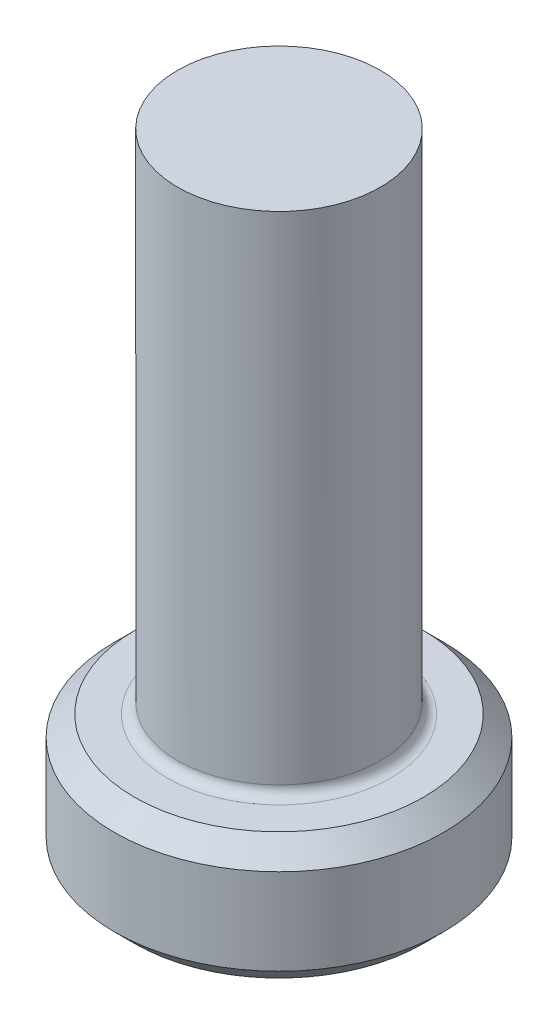
ISO-10303-21;
HEADER;
FILE_DESCRIPTION(('STEP AP214'),'2;1');
FILE_NAME('part.step','',(''),(''),'','','');
FILE_SCHEMA(('AUTOMOTIVE_DESIGN { 1 0 10303 214 1 1 1 1 }'));
ENDSEC;
DATA;
#1=APPLICATION_CONTEXT('core data for automotive mechanical design processes');
#2=APPLICATION_PROTOCOL_DEFINITION('international standard','automotive_design',2000,#1);
#3=PRODUCT_CONTEXT('',#1,'mechanical');
#4=PRODUCT('Part','Part','',(#3));
#5=PRODUCT_RELATED_PRODUCT_CATEGORY('part','',(#4));
#6=PRODUCT_DEFINITION_FORMATION('','',#4);
#7=PRODUCT_DEFINITION_CONTEXT('part definition',#1,'design');
#8=PRODUCT_DEFINITION('design','',#6,#7);
#9=PRODUCT_DEFINITION_SHAPE('','',#8);
#10=(LENGTH_UNIT() NAMED_UNIT(*) SI_UNIT(.MILLI.,.METRE.));
#11=(NAMED_UNIT(*) PLANE_ANGLE_UNIT() SI_UNIT($,.RADIAN.));
#12=(NAMED_UNIT(*) SI_UNIT($,.STERADIAN.) SOLID_ANGLE_UNIT());
#13=UNCERTAINTY_MEASURE_WITH_UNIT(LENGTH_MEASURE(1.E-05),#10,'distance_accuracy_value','');
#14=(GEOMETRIC_REPRESENTATION_CONTEXT(3) GLOBAL_UNCERTAINTY_ASSIGNED_CONTEXT((#13)) GLOBAL_UNIT_ASSIGNED_CONTEXT((#10,
#11,#12)) REPRESENTATION_CONTEXT('',''));
#15=CARTESIAN_POINT('',(0.,0.,0.));
#16=DIRECTION('',(0.,0.,1.));
#17=DIRECTION('',(1.,0.,0.));
#18=AXIS2_PLACEMENT_3D('',#15,#16,#17);
#19=CARTESIAN_POINT('',(-196.679346014084,-605.774998597379,-866.486183378033));
#20=DIRECTION('',(0.,1.,0.));
#21=DIRECTION('',(-1.,0.,0.));
#22=AXIS2_PLACEMENT_3D('',#19,#20,#21);
#23=PLANE('',#22);
#24=DIRECTION('',(-0.5,0.,0.866025403784439));
#25=VECTOR('',#24,1.);
#26=CARTESIAN_POINT('',(-199.566097360032,-605.774998597379,-866.486183378033));
#27=LINE('',#26,#25);
#28=CARTESIAN_POINT('',(-199.566097360032,-605.774998597379,-866.486183378033));
#29=VERTEX_POINT('',#28);
#30=CARTESIAN_POINT('',(-198.122721687058,-605.774998597379,-868.986183378033));
#31=VERTEX_POINT('',#30);
#32=EDGE_CURVE('E322',#29,#31,#27,.F.);
#33=ORIENTED_EDGE('',*,*,#32,.T.);
#34=DIRECTION('',(-1.,0.,0.));
#35=VECTOR('',#34,1.);
#36=CARTESIAN_POINT('',(-198.122721687058,-605.774998597379,-868.986183378033));
#37=LINE('',#36,#35);
#38=CARTESIAN_POINT('',(-195.23597034111,-605.774998597379,-868.986183378033));
#39=VERTEX_POINT('',#38);
#40=EDGE_CURVE('E327',#31,#39,#37,.F.);
#41=ORIENTED_EDGE('',*,*,#40,.T.);
#42=DIRECTION('',(-0.5,0.,-0.866025403784439));
#43=VECTOR('',#42,1.);
#44=CARTESIAN_POINT('',(-195.23597034111,-605.774998597379,-868.986183378033));
#45=LINE('',#44,#43);
#46=CARTESIAN_POINT('',(-193.792594668136,-605.774998597379,-866.486183378033));
#47=VERTEX_POINT('',#46);
#48=EDGE_CURVE('E305',#39,#47,#45,.F.);
#49=ORIENTED_EDGE('',*,*,#48,.T.);
#50=DIRECTION('',(0.5,0.,-0.866025403784439));
#51=VECTOR('',#50,1.);
#52=CARTESIAN_POINT('',(-193.792594668136,-605.774998597379,-866.486183378033));
#53=LINE('',#52,#51);
#54=CARTESIAN_POINT('',(-195.23597034111,-605.774998597379,-863.986183378033));
#55=VERTEX_POINT('',#54);
#56=EDGE_CURVE('E91',#47,#55,#53,.F.);
#57=ORIENTED_EDGE('',*,*,#56,.T.);
#58=DIRECTION('',(1.,0.,0.));
#59=VECTOR('',#58,1.);
#60=CARTESIAN_POINT('',(-195.23597034111,-605.774998597379,-863.986183378033));
#61=LINE('',#60,#59);
#62=CARTESIAN_POINT('',(-198.122721687058,-605.774998597379,-863.986183378033));
#63=VERTEX_POINT('',#62);
#64=EDGE_CURVE('E75',#55,#63,#61,.F.);
#65=ORIENTED_EDGE('',*,*,#64,.T.);
#66=DIRECTION('',(0.5,0.,0.866025403784439));
#67=VECTOR('',#66,1.);
#68=CARTESIAN_POINT('',(-198.122721687058,-605.774998597379,-863.986183378033));
#69=LINE('',#68,#67);
#70=EDGE_CURVE('E80',#63,#29,#69,.F.);
#71=ORIENTED_EDGE('',*,*,#70,.T.);
#72=EDGE_LOOP('',(#33,#41,#49,#57,#65,#71));
#73=FACE_BOUND('',#72,.T.);
#74=ADVANCED_FACE('F17',(#73),#23,.F.);
#75=CARTESIAN_POINT('',(-198.122721687058,-609.574998597379,-863.986183378033));
#76=DIRECTION('',(-0.866025403784439,0.,0.5));
#77=DIRECTION('',(0.5,0.,0.866025403784439));
#78=AXIS2_PLACEMENT_3D('',#75,#76,#77);
#79=PLANE('',#78);
#80=DIRECTION('',(0.,1.,0.));
#81=VECTOR('',#80,1.);
#82=CARTESIAN_POINT('',(-198.122721687058,-609.574998597379,-863.986183378033));
#83=LINE('',#82,#81);
#84=CARTESIAN_POINT('',(-198.122721687058,-609.574998597379,-863.986183378033));
#85=VERTEX_POINT('',#84);
#86=EDGE_CURVE('E82',#63,#85,#83,.F.);
#87=ORIENTED_EDGE('',*,*,#86,.T.);
#88=DIRECTION('',(0.499999999999843,0.,0.866025403784529));
#89=VECTOR('',#88,1.);
#90=CARTESIAN_POINT('',(-199.566097360032,-609.574998597379,-866.486183378034));
#91=LINE('',#90,#89);
#92=CARTESIAN_POINT('',(-199.566097360032,-609.574998597379,-866.486183378034));
#93=VERTEX_POINT('',#92);
#94=EDGE_CURVE('E317',#93,#85,#91,.T.);
#95=ORIENTED_EDGE('',*,*,#94,.F.);
#96=DIRECTION('',(0.,1.,0.));
#97=VECTOR('',#96,1.);
#98=CARTESIAN_POINT('',(-199.566097360032,-609.574998597379,-866.486183378034));
#99=LINE('',#98,#97);
#100=EDGE_CURVE('E85',#93,#29,#99,.T.);
#101=ORIENTED_EDGE('',*,*,#100,.T.);
#102=ORIENTED_EDGE('',*,*,#70,.F.);
#103=EDGE_LOOP('',(#87,#95,#101,#102));
#104=FACE_BOUND('',#103,.T.);
#105=ADVANCED_FACE('F81',(#104),#79,.F.);
#106=CARTESIAN_POINT('',(-195.23597034111,-609.574998597379,-863.986183378033));
#107=DIRECTION('',(0.,0.,1.));
#108=DIRECTION('',(1.,0.,0.));
#109=AXIS2_PLACEMENT_3D('',#106,#107,#108);
#110=PLANE('',#109);
#111=DIRECTION('',(0.,1.,0.));
#112=VECTOR('',#111,1.);
#113=CARTESIAN_POINT('',(-195.23597034111,-609.574998597379,-863.986183378033));
#114=LINE('',#113,#112);
#115=CARTESIAN_POINT('',(-195.23597034111,-609.574998597379,-863.986183378033));
#116=VERTEX_POINT('',#115);
#117=EDGE_CURVE('E93',#55,#116,#114,.F.);
#118=ORIENTED_EDGE('',*,*,#117,.T.);
#119=DIRECTION('',(1.,0.,0.));
#120=VECTOR('',#119,1.);
#121=CARTESIAN_POINT('',(-196.679346014084,-609.574998597379,-863.986183378033));
#122=LINE('',#121,#120);
#123=EDGE_CURVE('E97',#85,#116,#122,.T.);
#124=ORIENTED_EDGE('',*,*,#123,.F.);
#125=ORIENTED_EDGE('',*,*,#86,.F.);
#126=ORIENTED_EDGE('',*,*,#64,.F.);
#127=EDGE_LOOP('',(#118,#124,#125,#126));
#128=FACE_BOUND('',#127,.T.);
#129=ADVANCED_FACE('F95',(#128),#110,.F.);
#130=CARTESIAN_POINT('',(-193.792594668136,-609.574998597379,-866.486183378033));
#131=DIRECTION('',(0.866025403784439,0.,0.5));
#132=DIRECTION('',(0.5,0.,-0.866025403784439));
#133=AXIS2_PLACEMENT_3D('',#130,#131,#132);
#134=PLANE('',#133);
#135=DIRECTION('',(0.,1.,0.));
#136=VECTOR('',#135,1.);
#137=CARTESIAN_POINT('',(-193.792594668136,-609.574998597379,-866.486183378033));
#138=LINE('',#137,#136);
#139=CARTESIAN_POINT('',(-193.792594668136,-609.574998597379,-866.486183378034));
#140=VERTEX_POINT('',#139);
#141=EDGE_CURVE('E301',#47,#140,#138,.F.);
#142=ORIENTED_EDGE('',*,*,#141,.T.);
#143=DIRECTION('',(0.499999999999843,0.,-0.866025403784529));
#144=VECTOR('',#143,1.);
#145=CARTESIAN_POINT('',(-195.23597034111,-609.574998597379,-863.986183378033));
#146=LINE('',#145,#144);
#147=EDGE_CURVE('E304',#116,#140,#146,.T.);
#148=ORIENTED_EDGE('',*,*,#147,.F.);
#149=ORIENTED_EDGE('',*,*,#117,.F.);
#150=ORIENTED_EDGE('',*,*,#56,.F.);
#151=EDGE_LOOP('',(#142,#148,#149,#150));
#152=FACE_BOUND('',#151,.T.);
#153=ADVANCED_FACE('F258',(#152),#134,.F.);
#154=CARTESIAN_POINT('',(-195.23597034111,-609.574998597379,-868.986183378033));
#155=DIRECTION('',(0.866025403784439,0.,-0.5));
#156=DIRECTION('',(-0.5,0.,-0.866025403784439));
#157=AXIS2_PLACEMENT_3D('',#154,#155,#156);
#158=PLANE('',#157);
#159=DIRECTION('',(0.,1.,0.));
#160=VECTOR('',#159,1.);
#161=CARTESIAN_POINT('',(-195.23597034111,-609.574998597379,-868.986183378033));
#162=LINE('',#161,#160);
#163=CARTESIAN_POINT('',(-195.23597034111,-609.574998597379,-868.986183378033));
#164=VERTEX_POINT('',#163);
#165=EDGE_CURVE('E310',#39,#164,#162,.F.);
#166=ORIENTED_EDGE('',*,*,#165,.T.);
#167=DIRECTION('',(-0.500000000000126,0.,-0.866025403784366));
#168=VECTOR('',#167,1.);
#169=CARTESIAN_POINT('',(-193.792594668136,-609.574998597379,-866.486183378034));
#170=LINE('',#169,#168);
#171=EDGE_CURVE('E308',#140,#164,#170,.T.);
#172=ORIENTED_EDGE('',*,*,#171,.F.);
#173=ORIENTED_EDGE('',*,*,#141,.F.);
#174=ORIENTED_EDGE('',*,*,#48,.F.);
#175=EDGE_LOOP('',(#166,#172,#173,#174));
#176=FACE_BOUND('',#175,.T.);
#177=ADVANCED_FACE('F249',(#176),#158,.F.);
#178=CARTESIAN_POINT('',(-198.122721687058,-609.574998597379,-868.986183378033));
#179=DIRECTION('',(0.,0.,-1.));
#180=DIRECTION('',(-1.,0.,0.));
#181=AXIS2_PLACEMENT_3D('',#178,#179,#180);
#182=PLANE('',#181);
#183=DIRECTION('',(0.,1.,0.));
#184=VECTOR('',#183,1.);
#185=CARTESIAN_POINT('',(-198.122721687058,-609.574998597379,-868.986183378033));
#186=LINE('',#185,#184);
#187=CARTESIAN_POINT('',(-198.122721687058,-609.574998597379,-868.986183378033));
#188=VERTEX_POINT('',#187);
#189=EDGE_CURVE('E325',#31,#188,#186,.F.);
#190=ORIENTED_EDGE('',*,*,#189,.T.);
#191=DIRECTION('',(1.,0.,0.));
#192=VECTOR('',#191,1.);
#193=CARTESIAN_POINT('',(-196.679346014084,-609.574998597379,-868.986183378033));
#194=LINE('',#193,#192);
#195=EDGE_CURVE('E313',#164,#188,#194,.F.);
#196=ORIENTED_EDGE('',*,*,#195,.F.);
#197=ORIENTED_EDGE('',*,*,#165,.F.);
#198=ORIENTED_EDGE('',*,*,#40,.F.);
#199=EDGE_LOOP('',(#190,#196,#197,#198));
#200=FACE_BOUND('',#199,.T.);
#201=ADVANCED_FACE('F240',(#200),#182,.F.);
#202=CARTESIAN_POINT('',(-199.566097360032,-609.574998597379,-866.486183378033));
#203=DIRECTION('',(-0.866025403784439,0.,-0.5));
#204=DIRECTION('',(-0.5,0.,0.866025403784439));
#205=AXIS2_PLACEMENT_3D('',#202,#203,#204);
#206=PLANE('',#205);
#207=ORIENTED_EDGE('',*,*,#100,.F.);
#208=DIRECTION('',(-0.500000000000126,0.,0.866025403784366));
#209=VECTOR('',#208,1.);
#210=CARTESIAN_POINT('',(-198.122721687058,-609.574998597379,-868.986183378033));
#211=LINE('',#210,#209);
#212=EDGE_CURVE('E112',#188,#93,#211,.T.);
#213=ORIENTED_EDGE('',*,*,#212,.F.);
#214=ORIENTED_EDGE('',*,*,#189,.F.);
#215=ORIENTED_EDGE('',*,*,#32,.F.);
#216=EDGE_LOOP('',(#207,#213,#214,#215));
#217=FACE_BOUND('',#216,.T.);
#218=ADVANCED_FACE('F231',(#217),#206,.F.);
#219=CARTESIAN_POINT('',(-196.679346014084,-609.574998597379,-869.336183378034));
#220=DIRECTION('',(0.,-1.,0.));
#221=DIRECTION('',(1.,0.,0.));
#222=AXIS2_PLACEMENT_3D('',#219,#220,#221);
#223=PLANE('',#222);
#224=ORIENTED_EDGE('',*,*,#195,.T.);
#225=ORIENTED_EDGE('',*,*,#212,.T.);
#226=ORIENTED_EDGE('',*,*,#94,.T.);
#227=ORIENTED_EDGE('',*,*,#123,.T.);
#228=ORIENTED_EDGE('',*,*,#147,.T.);
#229=ORIENTED_EDGE('',*,*,#171,.T.);
#230=EDGE_LOOP('',(#224,#225,#226,#227,#228,#229));
#231=FACE_BOUND('',#230,.T.);
#232=CARTESIAN_POINT('',(-196.679346014084,-609.574998597379,-866.486183378033));
#233=DIRECTION('',(0.,1.,0.));
#234=DIRECTION('',(0.,0.,1.));
#235=AXIS2_PLACEMENT_3D('',#232,#233,#234);
#236=CIRCLE('',#235,5.69999999999893);
#237=CARTESIAN_POINT('',(-196.679346014084,-609.574998597379,-860.786183378034));
#238=VERTEX_POINT('',#237);
#239=EDGE_CURVE('E109',#238,#238,#236,.T.);
#240=ORIENTED_EDGE('',*,*,#239,.F.);
#241=EDGE_LOOP('',(#240));
#242=FACE_BOUND('',#241,.T.);
#243=ADVANCED_FACE('F222',(#231,#242),#223,.T.);
#244=CARTESIAN_POINT('',(-196.679346014084,-608.774998597378,-866.486183378033));
#245=DIRECTION('',(0.,1.,0.));
#246=DIRECTION('',(0.,0.,1.));
#247=AXIS2_PLACEMENT_3D('',#244,#245,#246);
#248=CONICAL_SURFACE('',#247,6.49999999999951,0.785398163397448);
#249=ORIENTED_EDGE('',*,*,#239,.T.);
#250=EDGE_LOOP('',(#249));
#251=FACE_BOUND('',#250,.T.);
#252=CARTESIAN_POINT('',(-196.679346014084,-608.774998597379,-866.486183378033));
#253=DIRECTION('',(0.,1.,0.));
#254=DIRECTION('',(-1.,0.,0.));
#255=AXIS2_PLACEMENT_3D('',#252,#253,#254);
#256=CIRCLE('',#255,6.49999999999998);
#257=CARTESIAN_POINT('',(-203.179346014084,-608.774998597379,-866.486183378033));
#258=VERTEX_POINT('',#257);
#259=EDGE_CURVE('E111',#258,#258,#256,.T.);
#260=ORIENTED_EDGE('',*,*,#259,.F.);
#261=EDGE_LOOP('',(#260));
#262=FACE_BOUND('',#261,.T.);
#263=ADVANCED_FACE('F214',(#251,#262),#248,.T.);
#264=CARTESIAN_POINT('',(-196.679346014084,-607.074998597379,-866.486183378033));
#265=DIRECTION('',(0.,1.,0.));
#266=DIRECTION('',(-1.,0.,0.));
#267=AXIS2_PLACEMENT_3D('',#264,#265,#266);
#268=CYLINDRICAL_SURFACE('',#267,6.49999999999998);
#269=CARTESIAN_POINT('',(-196.679346014084,-605.374998597379,-866.486183378033));
#270=DIRECTION('',(0.,-1.,0.));
#271=DIRECTION('',(0.,0.,-1.));
#272=AXIS2_PLACEMENT_3D('',#269,#270,#271);
#273=CIRCLE('',#272,6.49999999999895);
#274=CARTESIAN_POINT('',(-196.679346014084,-605.374998597379,-872.986183378032));
#275=VERTEX_POINT('',#274);
#276=EDGE_CURVE('E108',#275,#275,#273,.F.);
#277=ORIENTED_EDGE('',*,*,#276,.F.);
#278=EDGE_LOOP('',(#277));
#279=FACE_BOUND('',#278,.T.);
#280=ORIENTED_EDGE('',*,*,#259,.T.);
#281=EDGE_LOOP('',(#280));
#282=FACE_BOUND('',#281,.T.);
#283=ADVANCED_FACE('F206',(#279,#282),#268,.T.);
#284=CARTESIAN_POINT('',(-196.679346014084,-605.374998597379,-866.486183378033));
#285=DIRECTION('',(0.,-1.,0.));
#286=DIRECTION('',(1.,0.,0.));
#287=AXIS2_PLACEMENT_3D('',#284,#285,#286);
#288=CONICAL_SURFACE('',#287,6.49999999999895,0.785398163397448);
#289=CARTESIAN_POINT('',(-196.679346014084,-604.574998597379,-866.486183378033));
#290=DIRECTION('',(0.,-1.,0.));
#291=DIRECTION('',(1.,0.,0.));
#292=AXIS2_PLACEMENT_3D('',#289,#290,#291);
#293=CIRCLE('',#292,5.69999999999948);
#294=CARTESIAN_POINT('',(-190.979346014085,-604.574998597379,-866.486183378033));
#295=VERTEX_POINT('',#294);
#296=EDGE_CURVE('E105',#295,#295,#293,.F.);
#297=ORIENTED_EDGE('',*,*,#296,.F.);
#298=EDGE_LOOP('',(#297));
#299=FACE_BOUND('',#298,.T.);
#300=ORIENTED_EDGE('',*,*,#276,.T.);
#301=EDGE_LOOP('',(#300));
#302=FACE_BOUND('',#301,.T.);
#303=ADVANCED_FACE('F136',(#299,#302),#288,.T.);
#304=CARTESIAN_POINT('',(-196.679346014084,-604.574998597379,-871.536183378033));
#305=DIRECTION('',(0.,1.,0.));
#306=DIRECTION('',(-1.,0.,0.));
#307=AXIS2_PLACEMENT_3D('',#304,#305,#306);
#308=PLANE('',#307);
#309=CARTESIAN_POINT('',(-196.679346014084,-604.57499859738,-866.486183378033));
#310=DIRECTION('',(0.,1.,0.));
#311=DIRECTION('',(0.,0.,1.));
#312=AXIS2_PLACEMENT_3D('',#309,#310,#311);
#313=CIRCLE('',#312,4.40000000000007);
#314=CARTESIAN_POINT('',(-196.679346014084,-604.57499859738,-870.886183378033));
#315=VERTEX_POINT('',#314);
#316=CARTESIAN_POINT('',(-196.679346014084,-604.57499859738,-862.086183378033));
#317=VERTEX_POINT('',#316);
#318=EDGE_CURVE('E104',#315,#317,#313,.F.);
#319=ORIENTED_EDGE('',*,*,#318,.T.);
#320=CARTESIAN_POINT('',(-196.679346014084,-604.57499859738,-866.486183378033));
#321=DIRECTION('',(0.,1.,0.));
#322=DIRECTION('',(0.,0.,-1.));
#323=AXIS2_PLACEMENT_3D('',#320,#321,#322);
#324=CIRCLE('',#323,4.40000000000007);
#325=EDGE_CURVE('E36',#317,#315,#324,.F.);
#326=ORIENTED_EDGE('',*,*,#325,.T.);
#327=EDGE_LOOP('',(#319,#326));
#328=FACE_BOUND('',#327,.T.);
#329=ORIENTED_EDGE('',*,*,#296,.T.);
#330=EDGE_LOOP('',(#329));
#331=FACE_BOUND('',#330,.T.);
#332=ADVANCED_FACE('F117',(#328,#331),#308,.T.);
#333=CARTESIAN_POINT('',(-196.679346014084,-584.57499859738,-868.486183378033));
#334=DIRECTION('',(0.,1.,0.));
#335=DIRECTION('',(-1.,0.,0.));
#336=AXIS2_PLACEMENT_3D('',#333,#334,#335);
#337=PLANE('',#336);
#338=CARTESIAN_POINT('',(-196.679346014084,-584.57499859738,-866.486183378033));
#339=DIRECTION('',(0.,1.,0.));
#340=DIRECTION('',(-1.,0.,0.));
#341=AXIS2_PLACEMENT_3D('',#338,#339,#340);
#342=CIRCLE('',#341,4.);
#343=CARTESIAN_POINT('',(-200.679346014084,-584.57499859738,-866.486183378033));
#344=VERTEX_POINT('',#343);
#345=EDGE_CURVE('E28',#344,#344,#342,.F.);
#346=ORIENTED_EDGE('',*,*,#345,.F.);
#347=EDGE_LOOP('',(#346));
#348=FACE_BOUND('',#347,.T.);
#349=ADVANCED_FACE('F135',(#348),#337,.T.);
#350=CARTESIAN_POINT('',(-196.679346014084,-604.17499859738,-866.486183378033));
#351=DIRECTION('',(0.,-1.,0.));
#352=DIRECTION('',(0.,0.,1.));
#353=AXIS2_PLACEMENT_3D('',#350,#351,#352);
#354=TOROIDAL_SURFACE('',#353,4.40000000000007,0.4);
#355=CARTESIAN_POINT('',(-196.679346014084,-604.17499859738,-866.486183378033));
#356=DIRECTION('',(0.,1.,0.));
#357=DIRECTION('',(-1.,0.,0.));
#358=AXIS2_PLACEMENT_3D('',#355,#356,#357);
#359=CIRCLE('',#358,4.);
#360=CARTESIAN_POINT('',(-200.679346014084,-604.17499859738,-866.486183378033));
#361=VERTEX_POINT('',#360);
#362=EDGE_CURVE('E11',#361,#361,#359,.T.);
#363=ORIENTED_EDGE('',*,*,#362,.F.);
#364=EDGE_LOOP('',(#363));
#365=FACE_BOUND('',#364,.T.);
#366=ORIENTED_EDGE('',*,*,#318,.F.);
#367=ORIENTED_EDGE('',*,*,#325,.F.);
#368=EDGE_LOOP('',(#366,#367));
#369=FACE_BOUND('',#368,.T.);
#370=ADVANCED_FACE('F114',(#365,#369),#354,.F.);
#371=CARTESIAN_POINT('',(-196.679346014084,-594.374998597379,-866.486183378033));
#372=DIRECTION('',(0.,1.,0.));
#373=DIRECTION('',(-1.,0.,0.));
#374=AXIS2_PLACEMENT_3D('',#371,#372,#373);
#375=CYLINDRICAL_SURFACE('',#374,4.);
#376=ORIENTED_EDGE('',*,*,#362,.T.);
#377=EDGE_LOOP('',(#376));
#378=FACE_BOUND('',#377,.T.);
#379=ORIENTED_EDGE('',*,*,#345,.T.);
#380=EDGE_LOOP('',(#379));
#381=FACE_BOUND('',#380,.T.);
#382=ADVANCED_FACE('F158',(#378,#381),#375,.T.);
#383=CLOSED_SHELL('',(#74,#105,#129,#153,#177,#201,#218,#243,#263,#283,#303,#332,#349,#370,#382));
#384=MANIFOLD_SOLID_BREP('B1',#383);
#385=ADVANCED_BREP_SHAPE_REPRESENTATION('',(#18,#384),#14);
#386=SHAPE_DEFINITION_REPRESENTATION(#9,#385);
ENDSEC;
END-ISO-10303-21;
